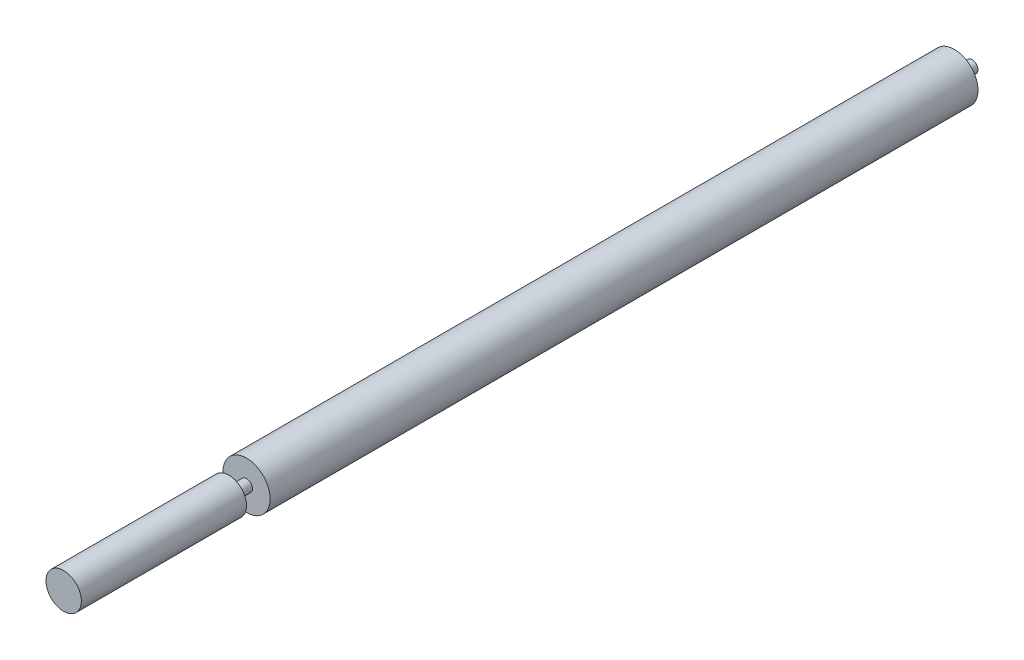
ISO-10303-21;
HEADER;
FILE_DESCRIPTION(('STEP AP214'),'2;1');
FILE_NAME('part.step','',(''),(''),'','','');
FILE_SCHEMA(('AUTOMOTIVE_DESIGN { 1 0 10303 214 1 1 1 1 }'));
ENDSEC;
DATA;
#1=APPLICATION_CONTEXT('core data for automotive mechanical design processes');
#2=APPLICATION_PROTOCOL_DEFINITION('international standard','automotive_design',2000,#1);
#3=PRODUCT_CONTEXT('',#1,'mechanical');
#4=PRODUCT('Part','Part','',(#3));
#5=PRODUCT_RELATED_PRODUCT_CATEGORY('part','',(#4));
#6=PRODUCT_DEFINITION_FORMATION('','',#4);
#7=PRODUCT_DEFINITION_CONTEXT('part definition',#1,'design');
#8=PRODUCT_DEFINITION('design','',#6,#7);
#9=PRODUCT_DEFINITION_SHAPE('','',#8);
#10=(LENGTH_UNIT() NAMED_UNIT(*) SI_UNIT(.MILLI.,.METRE.));
#11=(NAMED_UNIT(*) PLANE_ANGLE_UNIT() SI_UNIT($,.RADIAN.));
#12=(NAMED_UNIT(*) SI_UNIT($,.STERADIAN.) SOLID_ANGLE_UNIT());
#13=UNCERTAINTY_MEASURE_WITH_UNIT(LENGTH_MEASURE(1.E-05),#10,'distance_accuracy_value','');
#14=(GEOMETRIC_REPRESENTATION_CONTEXT(3) GLOBAL_UNCERTAINTY_ASSIGNED_CONTEXT((#13)) GLOBAL_UNIT_ASSIGNED_CONTEXT((#10,
#11,#12)) REPRESENTATION_CONTEXT('',''));
#15=CARTESIAN_POINT('',(0.,0.,0.));
#16=DIRECTION('',(0.,0.,1.));
#17=DIRECTION('',(1.,0.,0.));
#18=AXIS2_PLACEMENT_3D('',#15,#16,#17);
#19=CARTESIAN_POINT('',(0.,0.,400.05));
#20=DIRECTION('',(0.,0.,-1.));
#21=DIRECTION('',(-1.,0.,0.));
#22=AXIS2_PLACEMENT_3D('',#19,#20,#21);
#23=CYLINDRICAL_SURFACE('',#22,6.35);
#24=CARTESIAN_POINT('',(0.,0.,381.));
#25=DIRECTION('',(0.,0.,1.));
#26=DIRECTION('',(1.,0.,0.));
#27=AXIS2_PLACEMENT_3D('',#24,#25,#26);
#28=CIRCLE('',#27,6.35);
#29=CARTESIAN_POINT('',(-6.35,0.,381.));
#30=VERTEX_POINT('',#29);
#31=EDGE_CURVE('E61',#30,#30,#28,.T.);
#32=CARTESIAN_POINT('',(0.,0.,400.05));
#33=DIRECTION('',(0.,0.,1.));
#34=DIRECTION('',(1.,0.,0.));
#35=AXIS2_PLACEMENT_3D('',#32,#33,#34);
#36=CIRCLE('',#35,6.35);
#37=CARTESIAN_POINT('',(-6.35,0.,400.05));
#38=VERTEX_POINT('',#37);
#39=EDGE_CURVE('E47',#38,#38,#36,.T.);
#40=CARTESIAN_POINT('',(-6.35,0.,381.));
#41=CARTESIAN_POINT('',(-6.35,0.,381.1984375));
#42=CARTESIAN_POINT('',(-6.35,0.,381.396875));
#43=CARTESIAN_POINT('',(-6.35,0.,381.79375));
#44=CARTESIAN_POINT('',(-6.35,0.,381.9921875));
#45=CARTESIAN_POINT('',(-6.35,0.,382.3890625));
#46=CARTESIAN_POINT('',(-6.35,0.,382.5875));
#47=CARTESIAN_POINT('',(-6.35,0.,382.984375));
#48=CARTESIAN_POINT('',(-6.35,0.,383.1828125));
#49=CARTESIAN_POINT('',(-6.35,0.,383.5796875));
#50=CARTESIAN_POINT('',(-6.35,0.,383.778125));
#51=CARTESIAN_POINT('',(-6.35,0.,384.175));
#52=CARTESIAN_POINT('',(-6.35,0.,384.3734375));
#53=CARTESIAN_POINT('',(-6.35,0.,384.7703125));
#54=CARTESIAN_POINT('',(-6.35,0.,384.96875));
#55=CARTESIAN_POINT('',(-6.35,0.,385.365625));
#56=CARTESIAN_POINT('',(-6.35,0.,385.5640625));
#57=CARTESIAN_POINT('',(-6.35,0.,385.9609375));
#58=CARTESIAN_POINT('',(-6.35,0.,386.159375));
#59=CARTESIAN_POINT('',(-6.35,0.,386.55625));
#60=CARTESIAN_POINT('',(-6.35,0.,386.7546875));
#61=CARTESIAN_POINT('',(-6.35,0.,387.1515625));
#62=CARTESIAN_POINT('',(-6.35,0.,387.35));
#63=CARTESIAN_POINT('',(-6.35,0.,387.746875));
#64=CARTESIAN_POINT('',(-6.35,0.,387.9453125));
#65=CARTESIAN_POINT('',(-6.35,0.,388.3421875));
#66=CARTESIAN_POINT('',(-6.35,0.,388.540625));
#67=CARTESIAN_POINT('',(-6.35,0.,388.9375));
#68=CARTESIAN_POINT('',(-6.35,0.,389.1359375));
#69=CARTESIAN_POINT('',(-6.35,0.,389.5328125));
#70=CARTESIAN_POINT('',(-6.35,0.,389.73125));
#71=CARTESIAN_POINT('',(-6.35,0.,390.128125));
#72=CARTESIAN_POINT('',(-6.35,0.,390.3265625));
#73=CARTESIAN_POINT('',(-6.35,0.,390.7234375));
#74=CARTESIAN_POINT('',(-6.35,0.,390.921875));
#75=CARTESIAN_POINT('',(-6.35,0.,391.31875));
#76=CARTESIAN_POINT('',(-6.35,0.,391.5171875));
#77=CARTESIAN_POINT('',(-6.35,0.,391.9140625));
#78=CARTESIAN_POINT('',(-6.35,0.,392.1125));
#79=CARTESIAN_POINT('',(-6.35,0.,392.509375));
#80=CARTESIAN_POINT('',(-6.35,0.,392.7078125));
#81=CARTESIAN_POINT('',(-6.35,0.,393.1046875));
#82=CARTESIAN_POINT('',(-6.35,0.,393.303125));
#83=CARTESIAN_POINT('',(-6.35,0.,393.7));
#84=CARTESIAN_POINT('',(-6.35,0.,393.8984375));
#85=CARTESIAN_POINT('',(-6.35,0.,394.2953125));
#86=CARTESIAN_POINT('',(-6.35,0.,394.49375));
#87=CARTESIAN_POINT('',(-6.35,0.,394.890625));
#88=CARTESIAN_POINT('',(-6.35,0.,395.0890625));
#89=CARTESIAN_POINT('',(-6.35,0.,395.4859375));
#90=CARTESIAN_POINT('',(-6.35,0.,395.684375));
#91=CARTESIAN_POINT('',(-6.35,0.,396.08125));
#92=CARTESIAN_POINT('',(-6.35,0.,396.2796875));
#93=CARTESIAN_POINT('',(-6.35,0.,396.6765625));
#94=CARTESIAN_POINT('',(-6.35,0.,396.875));
#95=CARTESIAN_POINT('',(-6.35,0.,397.271875));
#96=CARTESIAN_POINT('',(-6.35,0.,397.4703125));
#97=CARTESIAN_POINT('',(-6.35,0.,397.8671875));
#98=CARTESIAN_POINT('',(-6.35,0.,398.065625));
#99=CARTESIAN_POINT('',(-6.35,0.,398.4625));
#100=CARTESIAN_POINT('',(-6.35,0.,398.6609375));
#101=CARTESIAN_POINT('',(-6.35,0.,399.0578125));
#102=CARTESIAN_POINT('',(-6.35,0.,399.25625));
#103=CARTESIAN_POINT('',(-6.35,0.,399.653125));
#104=CARTESIAN_POINT('',(-6.35,0.,399.8515625));
#105=CARTESIAN_POINT('',(-6.35,0.,400.05));
#106=B_SPLINE_CURVE_WITH_KNOTS('',3,(#40,#41,#42,#43,#44,#45,#46,#47,#48,#49,#50,#51,#52,#53,
#54,#55,#56,#57,#58,#59,#60,#61,#62,#63,#64,#65,#66,#67,#68,#69,#70,#71,#72,#73,#74,#75,#76,#77,
#78,#79,#80,#81,#82,#83,#84,#85,#86,#87,#88,#89,#90,#91,#92,#93,#94,#95,#96,#97,#98,#99,#100,
#101,#102,#103,#104,#105),.UNSPECIFIED.,.F.,.F.,(4,2,2,2,2,2,2,2,2,2,2,2,2,2,2,2,2,2,2,2,2,2,2,
2,2,2,2,2,2,2,2,2,4),(0.,0.5953125,1.190625,1.7859375,2.38125,2.9765625,3.571875,4.1671875,
4.7625,5.3578125,5.953125,6.5484375,7.14375,7.7390625,8.334375,8.92968750000001,
9.52500000000001,10.1203125,10.715625,11.3109375,11.90625,12.5015625,13.096875,13.6921875,
14.2875,14.8828125,15.478125,16.0734375,16.66875,17.2640625,17.859375,18.4546875,19.05),.UNSPECIFIED.);
#107=EDGE_CURVE('BSEAM41',#30,#38,#106,.T.);
#108=ORIENTED_EDGE('',*,*,#31,.T.);
#109=ORIENTED_EDGE('',*,*,#39,.F.);
#110=ORIENTED_EDGE('',*,*,#107,.T.);
#111=ORIENTED_EDGE('',*,*,#107,.F.);
#112=EDGE_LOOP('',(#108,#110,#109,#111));
#113=FACE_BOUND('',#112,.T.);
#114=ADVANCED_FACE('F41',(#113),#23,.T.);
#115=CARTESIAN_POINT('',(0.,0.,381.));
#116=DIRECTION('',(0.,0.,1.));
#117=DIRECTION('',(1.,0.,0.));
#118=AXIS2_PLACEMENT_3D('',#115,#116,#117);
#119=PLANE('',#118);
#120=CARTESIAN_POINT('',(0.,0.,381.));
#121=DIRECTION('',(0.,0.,1.));
#122=DIRECTION('',(1.,0.,0.));
#123=AXIS2_PLACEMENT_3D('',#120,#121,#122);
#124=CIRCLE('',#123,25.4);
#125=CARTESIAN_POINT('',(25.4,0.,381.));
#126=VERTEX_POINT('',#125);
#127=EDGE_CURVE('E56',#126,#126,#124,.T.);
#128=ORIENTED_EDGE('',*,*,#127,.T.);
#129=EDGE_LOOP('',(#128));
#130=FACE_BOUND('',#129,.T.);
#131=ORIENTED_EDGE('',*,*,#31,.F.);
#132=EDGE_LOOP('',(#131));
#133=FACE_BOUND('',#132,.T.);
#134=ADVANCED_FACE('F90',(#130,#133),#119,.T.);
#135=CARTESIAN_POINT('',(0.,0.,-381.));
#136=DIRECTION('',(0.,0.,1.));
#137=DIRECTION('',(1.,0.,0.));
#138=AXIS2_PLACEMENT_3D('',#135,#136,#137);
#139=PLANE('',#138);
#140=CARTESIAN_POINT('',(0.,0.,-381.));
#141=DIRECTION('',(0.,0.,1.));
#142=DIRECTION('',(1.,0.,0.));
#143=AXIS2_PLACEMENT_3D('',#140,#141,#142);
#144=CIRCLE('',#143,25.4);
#145=CARTESIAN_POINT('',(25.4,0.,-381.));
#146=VERTEX_POINT('',#145);
#147=EDGE_CURVE('E58',#146,#146,#144,.T.);
#148=ORIENTED_EDGE('',*,*,#147,.F.);
#149=EDGE_LOOP('',(#148));
#150=FACE_BOUND('',#149,.T.);
#151=CARTESIAN_POINT('',(0.,0.,-381.));
#152=DIRECTION('',(0.,0.,1.));
#153=DIRECTION('',(1.,0.,0.));
#154=AXIS2_PLACEMENT_3D('',#151,#152,#153);
#155=CIRCLE('',#154,6.35);
#156=CARTESIAN_POINT('',(-6.35,0.,-381.));
#157=VERTEX_POINT('',#156);
#158=EDGE_CURVE('E10',#157,#157,#155,.T.);
#159=ORIENTED_EDGE('',*,*,#158,.T.);
#160=EDGE_LOOP('',(#159));
#161=FACE_BOUND('',#160,.T.);
#162=ADVANCED_FACE('F95',(#150,#161),#139,.F.);
#163=CARTESIAN_POINT('',(0.,0.,381.));
#164=DIRECTION('',(0.,0.,-1.));
#165=DIRECTION('',(-1.,0.,0.));
#166=AXIS2_PLACEMENT_3D('',#163,#164,#165);
#167=CYLINDRICAL_SURFACE('',#166,25.4);
#168=ORIENTED_EDGE('',*,*,#127,.F.);
#169=EDGE_LOOP('',(#168));
#170=FACE_BOUND('',#169,.T.);
#171=ORIENTED_EDGE('',*,*,#147,.T.);
#172=EDGE_LOOP('',(#171));
#173=FACE_BOUND('',#172,.T.);
#174=ADVANCED_FACE('F105',(#170,#173),#167,.T.);
#175=CARTESIAN_POINT('',(0.,0.,-400.05));
#176=DIRECTION('',(0.,0.,1.));
#177=DIRECTION('',(1.,0.,0.));
#178=AXIS2_PLACEMENT_3D('',#175,#176,#177);
#179=PLANE('',#178);
#180=CARTESIAN_POINT('',(0.,0.,-400.05));
#181=DIRECTION('',(0.,0.,1.));
#182=DIRECTION('',(1.,0.,0.));
#183=AXIS2_PLACEMENT_3D('',#180,#181,#182);
#184=CIRCLE('',#183,6.35);
#185=CARTESIAN_POINT('',(-6.35,0.,-400.05));
#186=VERTEX_POINT('',#185);
#187=EDGE_CURVE('E51',#186,#186,#184,.T.);
#188=ORIENTED_EDGE('',*,*,#187,.F.);
#189=EDGE_LOOP('',(#188));
#190=FACE_BOUND('',#189,.T.);
#191=ADVANCED_FACE('F100',(#190),#179,.F.);
#192=CARTESIAN_POINT('',(-6.35,0.,-400.05));
#193=CARTESIAN_POINT('',(-6.35,0.,-399.8515625));
#194=CARTESIAN_POINT('',(-6.35,0.,-399.653125));
#195=CARTESIAN_POINT('',(-6.35,0.,-399.25625));
#196=CARTESIAN_POINT('',(-6.35,0.,-399.0578125));
#197=CARTESIAN_POINT('',(-6.35,0.,-398.6609375));
#198=CARTESIAN_POINT('',(-6.35,0.,-398.4625));
#199=CARTESIAN_POINT('',(-6.35,0.,-398.065625));
#200=CARTESIAN_POINT('',(-6.35,0.,-397.8671875));
#201=CARTESIAN_POINT('',(-6.35,0.,-397.4703125));
#202=CARTESIAN_POINT('',(-6.35,0.,-397.271875));
#203=CARTESIAN_POINT('',(-6.35,0.,-396.875));
#204=CARTESIAN_POINT('',(-6.35,0.,-396.6765625));
#205=CARTESIAN_POINT('',(-6.35,0.,-396.2796875));
#206=CARTESIAN_POINT('',(-6.35,0.,-396.08125));
#207=CARTESIAN_POINT('',(-6.35,0.,-395.684375));
#208=CARTESIAN_POINT('',(-6.35,0.,-395.4859375));
#209=CARTESIAN_POINT('',(-6.35,0.,-395.0890625));
#210=CARTESIAN_POINT('',(-6.35,0.,-394.890625));
#211=CARTESIAN_POINT('',(-6.35,0.,-394.49375));
#212=CARTESIAN_POINT('',(-6.35,0.,-394.2953125));
#213=CARTESIAN_POINT('',(-6.35,0.,-393.8984375));
#214=CARTESIAN_POINT('',(-6.35,0.,-393.7));
#215=CARTESIAN_POINT('',(-6.35,0.,-393.303125));
#216=CARTESIAN_POINT('',(-6.35,0.,-393.1046875));
#217=CARTESIAN_POINT('',(-6.35,0.,-392.7078125));
#218=CARTESIAN_POINT('',(-6.35,0.,-392.509375));
#219=CARTESIAN_POINT('',(-6.35,0.,-392.1125));
#220=CARTESIAN_POINT('',(-6.35,0.,-391.9140625));
#221=CARTESIAN_POINT('',(-6.35,0.,-391.5171875));
#222=CARTESIAN_POINT('',(-6.35,0.,-391.31875));
#223=CARTESIAN_POINT('',(-6.35,0.,-390.921875));
#224=CARTESIAN_POINT('',(-6.35,0.,-390.7234375));
#225=CARTESIAN_POINT('',(-6.35,0.,-390.3265625));
#226=CARTESIAN_POINT('',(-6.35,0.,-390.128125));
#227=CARTESIAN_POINT('',(-6.35,0.,-389.73125));
#228=CARTESIAN_POINT('',(-6.35,0.,-389.5328125));
#229=CARTESIAN_POINT('',(-6.35,0.,-389.1359375));
#230=CARTESIAN_POINT('',(-6.35,0.,-388.9375));
#231=CARTESIAN_POINT('',(-6.35,0.,-388.540625));
#232=CARTESIAN_POINT('',(-6.35,0.,-388.3421875));
#233=CARTESIAN_POINT('',(-6.35,0.,-387.9453125));
#234=CARTESIAN_POINT('',(-6.35,0.,-387.746875));
#235=CARTESIAN_POINT('',(-6.35,0.,-387.35));
#236=CARTESIAN_POINT('',(-6.35,0.,-387.1515625));
#237=CARTESIAN_POINT('',(-6.35,0.,-386.7546875));
#238=CARTESIAN_POINT('',(-6.35,0.,-386.55625));
#239=CARTESIAN_POINT('',(-6.35,0.,-386.159375));
#240=CARTESIAN_POINT('',(-6.35,0.,-385.9609375));
#241=CARTESIAN_POINT('',(-6.35,0.,-385.5640625));
#242=CARTESIAN_POINT('',(-6.35,0.,-385.365625));
#243=CARTESIAN_POINT('',(-6.35,0.,-384.96875));
#244=CARTESIAN_POINT('',(-6.35,0.,-384.7703125));
#245=CARTESIAN_POINT('',(-6.35,0.,-384.3734375));
#246=CARTESIAN_POINT('',(-6.35,0.,-384.175));
#247=CARTESIAN_POINT('',(-6.35,0.,-383.778125));
#248=CARTESIAN_POINT('',(-6.35,0.,-383.5796875));
#249=CARTESIAN_POINT('',(-6.35,0.,-383.1828125));
#250=CARTESIAN_POINT('',(-6.35,0.,-382.984375));
#251=CARTESIAN_POINT('',(-6.35,0.,-382.5875));
#252=CARTESIAN_POINT('',(-6.35,0.,-382.3890625));
#253=CARTESIAN_POINT('',(-6.35,0.,-381.9921875));
#254=CARTESIAN_POINT('',(-6.35,0.,-381.79375));
#255=CARTESIAN_POINT('',(-6.35,0.,-381.396875));
#256=CARTESIAN_POINT('',(-6.35,0.,-381.1984375));
#257=CARTESIAN_POINT('',(-6.35,0.,-381.));
#258=B_SPLINE_CURVE_WITH_KNOTS('',3,(#192,#193,#194,#195,#196,#197,#198,#199,#200,#201,#202,
#203,#204,#205,#206,#207,#208,#209,#210,#211,#212,#213,#214,#215,#216,#217,#218,#219,#220,#221,
#222,#223,#224,#225,#226,#227,#228,#229,#230,#231,#232,#233,#234,#235,#236,#237,#238,#239,#240,
#241,#242,#243,#244,#245,#246,#247,#248,#249,#250,#251,#252,#253,#254,#255,#256,#257),
.UNSPECIFIED.,.F.,.F.,(4,2,2,2,2,2,2,2,2,2,2,2,2,2,2,2,2,2,2,2,2,2,2,2,2,2,2,2,2,2,2,2,4),(0.,
0.5953125,1.190625,1.7859375,2.38125,2.9765625,3.571875,4.1671875,4.7625,5.35781249999989,
5.95312499999989,6.54843749999989,7.14374999999989,7.73906249999989,8.33437499999989,
8.92968749999989,9.5249999999999,10.1203124999999,10.7156249999999,11.3109374999999,
11.9062499999999,12.5015624999999,13.0968749999999,13.6921874999999,14.2874999999998,
14.8828124999998,15.4781249999998,16.0734374999998,16.6687499999998,17.2640624999998,
17.8593749999998,18.4546874999998,19.0499999999998),.UNSPECIFIED.);
#259=EDGE_CURVE('BSEAM78',#186,#157,#258,.T.);
#260=ORIENTED_EDGE('',*,*,#187,.T.);
#261=ORIENTED_EDGE('',*,*,#158,.F.);
#262=ORIENTED_EDGE('',*,*,#259,.T.);
#263=ORIENTED_EDGE('',*,*,#259,.F.);
#264=EDGE_LOOP('',(#260,#262,#261,#263));
#265=FACE_BOUND('',#264,.T.);
#266=ADVANCED_FACE('F78',(#265),#23,.T.);
#267=CARTESIAN_POINT('',(0.,0.,577.85));
#268=DIRECTION('',(0.,0.,-1.));
#269=DIRECTION('',(-1.,0.,0.));
#270=AXIS2_PLACEMENT_3D('',#267,#268,#269);
#271=CYLINDRICAL_SURFACE('',#270,19.05);
#272=CARTESIAN_POINT('',(0.,0.,577.85));
#273=DIRECTION('',(0.,0.,1.));
#274=DIRECTION('',(1.,0.,0.));
#275=AXIS2_PLACEMENT_3D('',#272,#273,#274);
#276=CIRCLE('',#275,19.05);
#277=CARTESIAN_POINT('',(19.05,0.,577.85));
#278=VERTEX_POINT('',#277);
#279=EDGE_CURVE('E66',#278,#278,#276,.T.);
#280=ORIENTED_EDGE('',*,*,#279,.F.);
#281=EDGE_LOOP('',(#280));
#282=FACE_BOUND('',#281,.T.);
#283=CARTESIAN_POINT('',(0.,0.,400.05));
#284=DIRECTION('',(0.,0.,1.));
#285=DIRECTION('',(1.,0.,0.));
#286=AXIS2_PLACEMENT_3D('',#283,#284,#285);
#287=CIRCLE('',#286,19.05);
#288=CARTESIAN_POINT('',(19.05,0.,400.05));
#289=VERTEX_POINT('',#288);
#290=EDGE_CURVE('E67',#289,#289,#287,.T.);
#291=ORIENTED_EDGE('',*,*,#290,.T.);
#292=EDGE_LOOP('',(#291));
#293=FACE_BOUND('',#292,.T.);
#294=ADVANCED_FACE('F75',(#282,#293),#271,.T.);
#295=CARTESIAN_POINT('',(0.,0.,577.85));
#296=DIRECTION('',(0.,0.,1.));
#297=DIRECTION('',(1.,0.,0.));
#298=AXIS2_PLACEMENT_3D('',#295,#296,#297);
#299=PLANE('',#298);
#300=ORIENTED_EDGE('',*,*,#279,.T.);
#301=EDGE_LOOP('',(#300));
#302=FACE_BOUND('',#301,.T.);
#303=ADVANCED_FACE('F73',(#302),#299,.T.);
#304=CARTESIAN_POINT('',(0.,0.,400.05));
#305=DIRECTION('',(0.,0.,1.));
#306=DIRECTION('',(1.,0.,0.));
#307=AXIS2_PLACEMENT_3D('',#304,#305,#306);
#308=PLANE('',#307);
#309=ORIENTED_EDGE('',*,*,#39,.T.);
#310=EDGE_LOOP('',(#309));
#311=FACE_BOUND('',#310,.T.);
#312=ORIENTED_EDGE('',*,*,#290,.F.);
#313=EDGE_LOOP('',(#312));
#314=FACE_BOUND('',#313,.T.);
#315=ADVANCED_FACE('F82',(#311,#314),#308,.F.);
#316=CLOSED_SHELL('',(#114,#134,#162,#174,#191,#266,#294,#303,#315));
#317=MANIFOLD_SOLID_BREP('B2',#316);
#318=ADVANCED_BREP_SHAPE_REPRESENTATION('',(#18,#317),#14);
#319=SHAPE_DEFINITION_REPRESENTATION(#9,#318);
ENDSEC;
END-ISO-10303-21;
